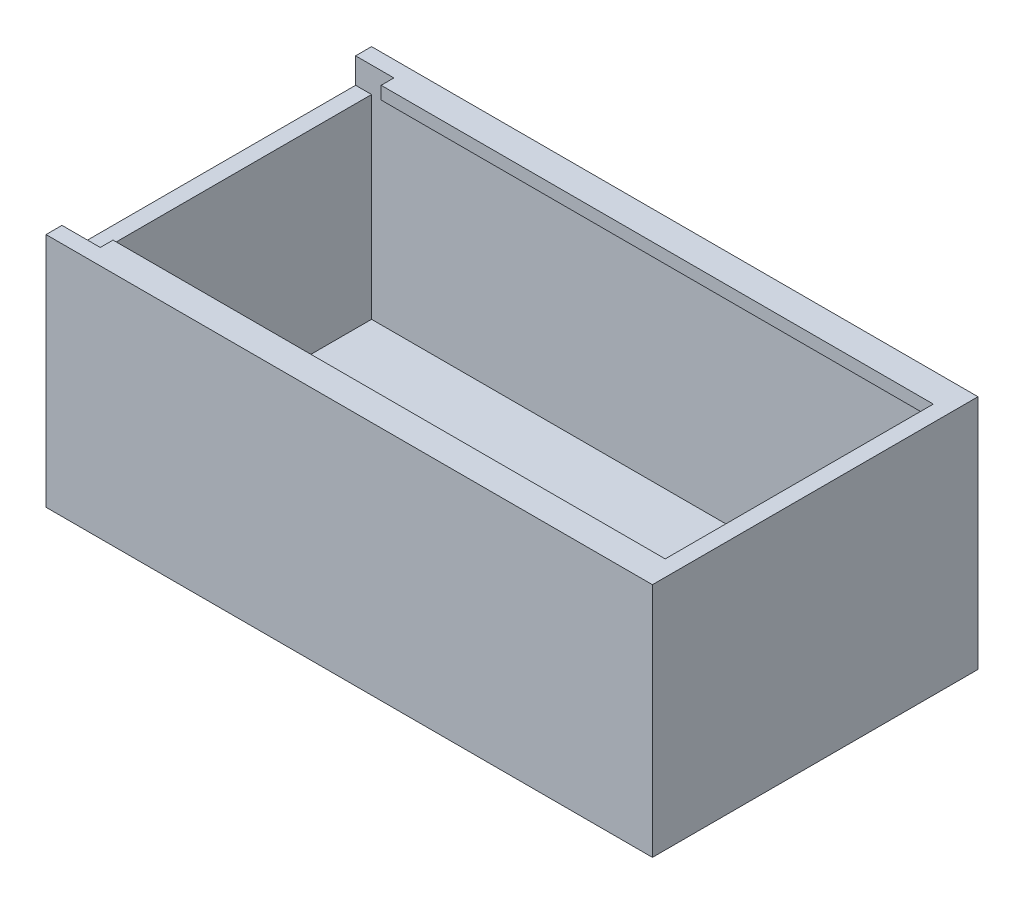
ISO-10303-21;
HEADER;
FILE_DESCRIPTION(('STEP AP214'),'2;1');
FILE_NAME('part.step','',(''),(''),'','','');
FILE_SCHEMA(('AUTOMOTIVE_DESIGN { 1 0 10303 214 1 1 1 1 }'));
ENDSEC;
DATA;
#1=APPLICATION_CONTEXT('core data for automotive mechanical design processes');
#2=APPLICATION_PROTOCOL_DEFINITION('international standard','automotive_design',2000,#1);
#3=PRODUCT_CONTEXT('',#1,'mechanical');
#4=PRODUCT('Part','Part','',(#3));
#5=PRODUCT_RELATED_PRODUCT_CATEGORY('part','',(#4));
#6=PRODUCT_DEFINITION_FORMATION('','',#4);
#7=PRODUCT_DEFINITION_CONTEXT('part definition',#1,'design');
#8=PRODUCT_DEFINITION('design','',#6,#7);
#9=PRODUCT_DEFINITION_SHAPE('','',#8);
#10=(LENGTH_UNIT() NAMED_UNIT(*) SI_UNIT(.MILLI.,.METRE.));
#11=(NAMED_UNIT(*) PLANE_ANGLE_UNIT() SI_UNIT($,.RADIAN.));
#12=(NAMED_UNIT(*) SI_UNIT($,.STERADIAN.) SOLID_ANGLE_UNIT());
#13=UNCERTAINTY_MEASURE_WITH_UNIT(LENGTH_MEASURE(1.E-05),#10,'distance_accuracy_value','');
#14=(GEOMETRIC_REPRESENTATION_CONTEXT(3) GLOBAL_UNCERTAINTY_ASSIGNED_CONTEXT((#13)) GLOBAL_UNIT_ASSIGNED_CONTEXT((#10,
#11,#12)) REPRESENTATION_CONTEXT('',''));
#15=CARTESIAN_POINT('',(0.,0.,0.));
#16=DIRECTION('',(0.,0.,1.));
#17=DIRECTION('',(1.,0.,0.));
#18=AXIS2_PLACEMENT_3D('',#15,#16,#17);
#19=CARTESIAN_POINT('',(0.,2.5,51.));
#20=DIRECTION('',(1.,0.,0.));
#21=DIRECTION('',(0.,0.,-1.));
#22=AXIS2_PLACEMENT_3D('',#19,#20,#21);
#23=PLANE('',#22);
#24=DIRECTION('',(0.,0.,1.));
#25=VECTOR('',#24,1.);
#26=CARTESIAN_POINT('',(0.,33.,2.5));
#27=LINE('',#26,#25);
#28=CARTESIAN_POINT('',(0.,33.,2.5));
#29=VERTEX_POINT('',#28);
#30=CARTESIAN_POINT('',(0.,33.,48.5));
#31=VERTEX_POINT('',#30);
#32=EDGE_CURVE('E205',#29,#31,#27,.T.);
#33=ORIENTED_EDGE('',*,*,#32,.F.);
#34=DIRECTION('',(0.,-1.,0.));
#35=VECTOR('',#34,1.);
#36=CARTESIAN_POINT('',(0.,37.,2.5));
#37=LINE('',#36,#35);
#38=CARTESIAN_POINT('',(0.,37.,2.5));
#39=VERTEX_POINT('',#38);
#40=EDGE_CURVE('E194',#39,#29,#37,.T.);
#41=ORIENTED_EDGE('',*,*,#40,.F.);
#42=DIRECTION('',(0.,0.,1.));
#43=VECTOR('',#42,1.);
#44=CARTESIAN_POINT('',(0.,37.,0.));
#45=LINE('',#44,#43);
#46=CARTESIAN_POINT('',(0.,37.,0.));
#47=VERTEX_POINT('',#46);
#48=EDGE_CURVE('E224',#47,#39,#45,.T.);
#49=ORIENTED_EDGE('',*,*,#48,.F.);
#50=DIRECTION('',(0.,-1.,0.));
#51=VECTOR('',#50,1.);
#52=CARTESIAN_POINT('',(0.,2.5,0.));
#53=LINE('',#52,#51);
#54=CARTESIAN_POINT('',(0.,0.,0.));
#55=VERTEX_POINT('',#54);
#56=EDGE_CURVE('E257',#47,#55,#53,.T.);
#57=ORIENTED_EDGE('',*,*,#56,.T.);
#58=DIRECTION('',(0.,0.,1.));
#59=VECTOR('',#58,1.);
#60=CARTESIAN_POINT('',(0.,0.,51.));
#61=LINE('',#60,#59);
#62=CARTESIAN_POINT('',(0.,0.,51.));
#63=VERTEX_POINT('',#62);
#64=EDGE_CURVE('E248',#55,#63,#61,.T.);
#65=ORIENTED_EDGE('',*,*,#64,.T.);
#66=DIRECTION('',(0.,-1.,0.));
#67=VECTOR('',#66,1.);
#68=CARTESIAN_POINT('',(0.,2.5,51.));
#69=LINE('',#68,#67);
#70=CARTESIAN_POINT('',(0.,37.,51.));
#71=VERTEX_POINT('',#70);
#72=EDGE_CURVE('E11',#71,#63,#69,.T.);
#73=ORIENTED_EDGE('',*,*,#72,.F.);
#74=CARTESIAN_POINT('',(0.,37.,48.5));
#75=VERTEX_POINT('',#74);
#76=EDGE_CURVE('E223',#75,#71,#45,.T.);
#77=ORIENTED_EDGE('',*,*,#76,.F.);
#78=DIRECTION('',(0.,1.,0.));
#79=VECTOR('',#78,1.);
#80=CARTESIAN_POINT('',(0.,37.,48.5));
#81=LINE('',#80,#79);
#82=EDGE_CURVE('E202',#31,#75,#81,.T.);
#83=ORIENTED_EDGE('',*,*,#82,.F.);
#84=EDGE_LOOP('',(#33,#41,#49,#57,#65,#73,#77,#83));
#85=FACE_BOUND('',#84,.T.);
#86=ADVANCED_FACE('F33',(#85),#23,.F.);
#87=CARTESIAN_POINT('',(95.,2.5,51.));
#88=DIRECTION('',(0.,0.,-1.));
#89=DIRECTION('',(-1.,0.,0.));
#90=AXIS2_PLACEMENT_3D('',#87,#88,#89);
#91=PLANE('',#90);
#92=DIRECTION('',(1.,0.,0.));
#93=VECTOR('',#92,1.);
#94=CARTESIAN_POINT('',(95.,0.,51.));
#95=LINE('',#94,#93);
#96=CARTESIAN_POINT('',(95.,0.,51.));
#97=VERTEX_POINT('',#96);
#98=EDGE_CURVE('E251',#63,#97,#95,.T.);
#99=ORIENTED_EDGE('',*,*,#98,.T.);
#100=DIRECTION('',(0.,-1.,0.));
#101=VECTOR('',#100,1.);
#102=CARTESIAN_POINT('',(95.,2.5,51.));
#103=LINE('',#102,#101);
#104=CARTESIAN_POINT('',(95.,37.,51.));
#105=VERTEX_POINT('',#104);
#106=EDGE_CURVE('E40',#105,#97,#103,.T.);
#107=ORIENTED_EDGE('',*,*,#106,.F.);
#108=DIRECTION('',(1.,0.,0.));
#109=VECTOR('',#108,1.);
#110=CARTESIAN_POINT('',(0.,37.,51.));
#111=LINE('',#110,#109);
#112=EDGE_CURVE('E227',#71,#105,#111,.T.);
#113=ORIENTED_EDGE('',*,*,#112,.F.);
#114=ORIENTED_EDGE('',*,*,#72,.T.);
#115=EDGE_LOOP('',(#99,#107,#113,#114));
#116=FACE_BOUND('',#115,.T.);
#117=ADVANCED_FACE('F283',(#116),#91,.F.);
#118=CARTESIAN_POINT('',(95.,2.5,0.));
#119=DIRECTION('',(-1.,0.,0.));
#120=DIRECTION('',(0.,0.,1.));
#121=AXIS2_PLACEMENT_3D('',#118,#119,#120);
#122=PLANE('',#121);
#123=DIRECTION('',(0.,0.,-1.));
#124=VECTOR('',#123,1.);
#125=CARTESIAN_POINT('',(95.,0.,0.));
#126=LINE('',#125,#124);
#127=CARTESIAN_POINT('',(95.,0.,0.));
#128=VERTEX_POINT('',#127);
#129=EDGE_CURVE('E253',#97,#128,#126,.T.);
#130=ORIENTED_EDGE('',*,*,#129,.T.);
#131=DIRECTION('',(0.,-1.,0.));
#132=VECTOR('',#131,1.);
#133=CARTESIAN_POINT('',(95.,2.5,0.));
#134=LINE('',#133,#132);
#135=CARTESIAN_POINT('',(95.,37.,0.));
#136=VERTEX_POINT('',#135);
#137=EDGE_CURVE('E260',#136,#128,#134,.T.);
#138=ORIENTED_EDGE('',*,*,#137,.F.);
#139=DIRECTION('',(0.,0.,-1.));
#140=VECTOR('',#139,1.);
#141=CARTESIAN_POINT('',(95.,37.,0.));
#142=LINE('',#141,#140);
#143=EDGE_CURVE('E230',#105,#136,#142,.T.);
#144=ORIENTED_EDGE('',*,*,#143,.F.);
#145=ORIENTED_EDGE('',*,*,#106,.T.);
#146=EDGE_LOOP('',(#130,#138,#144,#145));
#147=FACE_BOUND('',#146,.T.);
#148=ADVANCED_FACE('F266',(#147),#122,.F.);
#149=CARTESIAN_POINT('',(0.,2.5,0.));
#150=DIRECTION('',(0.,0.,1.));
#151=DIRECTION('',(1.,0.,0.));
#152=AXIS2_PLACEMENT_3D('',#149,#150,#151);
#153=PLANE('',#152);
#154=DIRECTION('',(-1.,0.,0.));
#155=VECTOR('',#154,1.);
#156=CARTESIAN_POINT('',(0.,0.,0.));
#157=LINE('',#156,#155);
#158=EDGE_CURVE('E255',#128,#55,#157,.T.);
#159=ORIENTED_EDGE('',*,*,#158,.T.);
#160=ORIENTED_EDGE('',*,*,#56,.F.);
#161=DIRECTION('',(-1.,0.,0.));
#162=VECTOR('',#161,1.);
#163=CARTESIAN_POINT('',(0.,37.,0.));
#164=LINE('',#163,#162);
#165=EDGE_CURVE('E233',#136,#47,#164,.T.);
#166=ORIENTED_EDGE('',*,*,#165,.F.);
#167=ORIENTED_EDGE('',*,*,#137,.T.);
#168=EDGE_LOOP('',(#159,#160,#166,#167));
#169=FACE_BOUND('',#168,.T.);
#170=ADVANCED_FACE('F274',(#169),#153,.F.);
#171=CARTESIAN_POINT('',(0.,0.,0.));
#172=DIRECTION('',(0.,-1.,0.));
#173=DIRECTION('',(0.,0.,-1.));
#174=AXIS2_PLACEMENT_3D('',#171,#172,#173);
#175=PLANE('',#174);
#176=ORIENTED_EDGE('',*,*,#64,.F.);
#177=ORIENTED_EDGE('',*,*,#158,.F.);
#178=ORIENTED_EDGE('',*,*,#129,.F.);
#179=ORIENTED_EDGE('',*,*,#98,.F.);
#180=EDGE_LOOP('',(#176,#177,#178,#179));
#181=FACE_BOUND('',#180,.T.);
#182=ADVANCED_FACE('F272',(#181),#175,.T.);
#183=CARTESIAN_POINT('',(2.5,37.,2.5));
#184=DIRECTION('',(1.,0.,0.));
#185=DIRECTION('',(0.,0.,-1.));
#186=AXIS2_PLACEMENT_3D('',#183,#184,#185);
#187=PLANE('',#186);
#188=DIRECTION('',(0.,0.,1.));
#189=VECTOR('',#188,1.);
#190=CARTESIAN_POINT('',(2.5,33.,2.5));
#191=LINE('',#190,#189);
#192=CARTESIAN_POINT('',(2.5,33.,2.5));
#193=VERTEX_POINT('',#192);
#194=CARTESIAN_POINT('',(2.5,33.,48.5));
#195=VERTEX_POINT('',#194);
#196=EDGE_CURVE('E198',#193,#195,#191,.T.);
#197=ORIENTED_EDGE('',*,*,#196,.T.);
#198=DIRECTION('',(0.,-1.,0.));
#199=VECTOR('',#198,1.);
#200=CARTESIAN_POINT('',(2.50000000000001,37.,48.5));
#201=LINE('',#200,#199);
#202=CARTESIAN_POINT('',(2.50000000000001,2.5,48.5));
#203=VERTEX_POINT('',#202);
#204=EDGE_CURVE('E221',#195,#203,#201,.T.);
#205=ORIENTED_EDGE('',*,*,#204,.T.);
#206=DIRECTION('',(0.,0.,1.));
#207=VECTOR('',#206,1.);
#208=CARTESIAN_POINT('',(2.5,2.5,0.));
#209=LINE('',#208,#207);
#210=CARTESIAN_POINT('',(2.5,2.5,2.5));
#211=VERTEX_POINT('',#210);
#212=EDGE_CURVE('E245',#211,#203,#209,.T.);
#213=ORIENTED_EDGE('',*,*,#212,.F.);
#214=DIRECTION('',(0.,-1.,0.));
#215=VECTOR('',#214,1.);
#216=CARTESIAN_POINT('',(2.5,37.,2.5));
#217=LINE('',#216,#215);
#218=EDGE_CURVE('E215',#193,#211,#217,.T.);
#219=ORIENTED_EDGE('',*,*,#218,.F.);
#220=EDGE_LOOP('',(#197,#205,#213,#219));
#221=FACE_BOUND('',#220,.T.);
#222=ADVANCED_FACE('F330',(#221),#187,.T.);
#223=CARTESIAN_POINT('',(2.50000000000001,37.,48.5));
#224=DIRECTION('',(0.,0.,-1.));
#225=DIRECTION('',(-1.,0.,0.));
#226=AXIS2_PLACEMENT_3D('',#223,#224,#225);
#227=PLANE('',#226);
#228=DIRECTION('',(-1.,0.,0.));
#229=VECTOR('',#228,1.);
#230=CARTESIAN_POINT('',(92.5,35.,48.5));
#231=LINE('',#230,#229);
#232=CARTESIAN_POINT('',(92.5,35.,48.5));
#233=VERTEX_POINT('',#232);
#234=CARTESIAN_POINT('',(6.,35.,48.5));
#235=VERTEX_POINT('',#234);
#236=EDGE_CURVE('E170',#233,#235,#231,.T.);
#237=ORIENTED_EDGE('',*,*,#236,.F.);
#238=DIRECTION('',(0.,-1.,0.));
#239=VECTOR('',#238,1.);
#240=CARTESIAN_POINT('',(92.5,37.,48.5));
#241=LINE('',#240,#239);
#242=CARTESIAN_POINT('',(92.5,2.5,48.5));
#243=VERTEX_POINT('',#242);
#244=EDGE_CURVE('E219',#233,#243,#241,.T.);
#245=ORIENTED_EDGE('',*,*,#244,.T.);
#246=DIRECTION('',(1.,0.,0.));
#247=VECTOR('',#246,1.);
#248=CARTESIAN_POINT('',(0.,2.5,48.5));
#249=LINE('',#248,#247);
#250=EDGE_CURVE('E242',#203,#243,#249,.T.);
#251=ORIENTED_EDGE('',*,*,#250,.F.);
#252=ORIENTED_EDGE('',*,*,#204,.F.);
#253=DIRECTION('',(-1.,0.,0.));
#254=VECTOR('',#253,1.);
#255=CARTESIAN_POINT('',(2.5,33.,48.5));
#256=LINE('',#255,#254);
#257=EDGE_CURVE('E210',#195,#31,#256,.T.);
#258=ORIENTED_EDGE('',*,*,#257,.T.);
#259=ORIENTED_EDGE('',*,*,#82,.T.);
#260=DIRECTION('',(1.,0.,0.));
#261=VECTOR('',#260,1.);
#262=CARTESIAN_POINT('',(2.50000000000001,37.,48.5));
#263=LINE('',#262,#261);
#264=CARTESIAN_POINT('',(6.,37.,48.5));
#265=VERTEX_POINT('',#264);
#266=EDGE_CURVE('E156',#75,#265,#263,.T.);
#267=ORIENTED_EDGE('',*,*,#266,.T.);
#268=DIRECTION('',(0.,1.,0.));
#269=VECTOR('',#268,1.);
#270=CARTESIAN_POINT('',(6.,37.,48.5));
#271=LINE('',#270,#269);
#272=EDGE_CURVE('E47',#235,#265,#271,.T.);
#273=ORIENTED_EDGE('',*,*,#272,.F.);
#274=EDGE_LOOP('',(#237,#245,#251,#252,#258,#259,#267,#273));
#275=FACE_BOUND('',#274,.T.);
#276=ADVANCED_FACE('F285',(#275),#227,.T.);
#277=CARTESIAN_POINT('',(92.5,37.,2.5));
#278=DIRECTION('',(-1.,0.,0.));
#279=DIRECTION('',(0.,0.,1.));
#280=AXIS2_PLACEMENT_3D('',#277,#278,#279);
#281=PLANE('',#280);
#282=DIRECTION('',(0.,0.,1.));
#283=VECTOR('',#282,1.);
#284=CARTESIAN_POINT('',(92.5,35.,48.5));
#285=LINE('',#284,#283);
#286=CARTESIAN_POINT('',(92.5,35.,46.5));
#287=VERTEX_POINT('',#286);
#288=EDGE_CURVE('E55',#287,#233,#285,.T.);
#289=ORIENTED_EDGE('',*,*,#288,.F.);
#290=DIRECTION('',(0.,-1.,0.));
#291=VECTOR('',#290,1.);
#292=CARTESIAN_POINT('',(92.5,37.,46.5));
#293=LINE('',#292,#291);
#294=CARTESIAN_POINT('',(92.5,37.,46.5));
#295=VERTEX_POINT('',#294);
#296=EDGE_CURVE('E159',#295,#287,#293,.T.);
#297=ORIENTED_EDGE('',*,*,#296,.F.);
#298=DIRECTION('',(0.,0.,-1.));
#299=VECTOR('',#298,1.);
#300=CARTESIAN_POINT('',(92.5,37.,2.5));
#301=LINE('',#300,#299);
#302=CARTESIAN_POINT('',(92.5,37.,4.5));
#303=VERTEX_POINT('',#302);
#304=EDGE_CURVE('E146',#295,#303,#301,.T.);
#305=ORIENTED_EDGE('',*,*,#304,.T.);
#306=DIRECTION('',(0.,1.,0.));
#307=VECTOR('',#306,1.);
#308=CARTESIAN_POINT('',(92.5,37.,4.5));
#309=LINE('',#308,#307);
#310=CARTESIAN_POINT('',(92.5,35.,4.5));
#311=VERTEX_POINT('',#310);
#312=EDGE_CURVE('E178',#311,#303,#309,.T.);
#313=ORIENTED_EDGE('',*,*,#312,.F.);
#314=DIRECTION('',(0.,0.,1.));
#315=VECTOR('',#314,1.);
#316=CARTESIAN_POINT('',(92.5,35.,2.5));
#317=LINE('',#316,#315);
#318=CARTESIAN_POINT('',(92.5,35.,2.5));
#319=VERTEX_POINT('',#318);
#320=EDGE_CURVE('E175',#319,#311,#317,.T.);
#321=ORIENTED_EDGE('',*,*,#320,.F.);
#322=DIRECTION('',(0.,-1.,0.));
#323=VECTOR('',#322,1.);
#324=CARTESIAN_POINT('',(92.5,37.,2.5));
#325=LINE('',#324,#323);
#326=CARTESIAN_POINT('',(92.5,2.5,2.5));
#327=VERTEX_POINT('',#326);
#328=EDGE_CURVE('E217',#319,#327,#325,.T.);
#329=ORIENTED_EDGE('',*,*,#328,.T.);
#330=DIRECTION('',(0.,0.,-1.));
#331=VECTOR('',#330,1.);
#332=CARTESIAN_POINT('',(92.5,2.5,0.));
#333=LINE('',#332,#331);
#334=EDGE_CURVE('E239',#243,#327,#333,.T.);
#335=ORIENTED_EDGE('',*,*,#334,.F.);
#336=ORIENTED_EDGE('',*,*,#244,.F.);
#337=EDGE_LOOP('',(#289,#297,#305,#313,#321,#329,#335,#336));
#338=FACE_BOUND('',#337,.T.);
#339=ADVANCED_FACE('F160',(#338),#281,.T.);
#340=CARTESIAN_POINT('',(2.5,37.,2.5));
#341=DIRECTION('',(0.,0.,1.));
#342=DIRECTION('',(1.,0.,0.));
#343=AXIS2_PLACEMENT_3D('',#340,#341,#342);
#344=PLANE('',#343);
#345=DIRECTION('',(-1.,0.,0.));
#346=VECTOR('',#345,1.);
#347=CARTESIAN_POINT('',(92.5,35.,2.5));
#348=LINE('',#347,#346);
#349=CARTESIAN_POINT('',(6.,35.,2.5));
#350=VERTEX_POINT('',#349);
#351=EDGE_CURVE('E181',#319,#350,#348,.T.);
#352=ORIENTED_EDGE('',*,*,#351,.T.);
#353=DIRECTION('',(0.,-1.,0.));
#354=VECTOR('',#353,1.);
#355=CARTESIAN_POINT('',(6.,37.,2.5));
#356=LINE('',#355,#354);
#357=CARTESIAN_POINT('',(6.,37.,2.5));
#358=VERTEX_POINT('',#357);
#359=EDGE_CURVE('E182',#358,#350,#356,.T.);
#360=ORIENTED_EDGE('',*,*,#359,.F.);
#361=DIRECTION('',(-1.,0.,0.));
#362=VECTOR('',#361,1.);
#363=CARTESIAN_POINT('',(2.5,37.,2.5));
#364=LINE('',#363,#362);
#365=EDGE_CURVE('E155',#358,#39,#364,.T.);
#366=ORIENTED_EDGE('',*,*,#365,.T.);
#367=ORIENTED_EDGE('',*,*,#40,.T.);
#368=DIRECTION('',(-1.,0.,0.));
#369=VECTOR('',#368,1.);
#370=CARTESIAN_POINT('',(2.5,33.,2.5));
#371=LINE('',#370,#369);
#372=EDGE_CURVE('E201',#193,#29,#371,.T.);
#373=ORIENTED_EDGE('',*,*,#372,.F.);
#374=ORIENTED_EDGE('',*,*,#218,.T.);
#375=DIRECTION('',(-1.,0.,0.));
#376=VECTOR('',#375,1.);
#377=CARTESIAN_POINT('',(0.,2.5,2.5));
#378=LINE('',#377,#376);
#379=EDGE_CURVE('E236',#327,#211,#378,.T.);
#380=ORIENTED_EDGE('',*,*,#379,.F.);
#381=ORIENTED_EDGE('',*,*,#328,.F.);
#382=EDGE_LOOP('',(#352,#360,#366,#367,#373,#374,#380,#381));
#383=FACE_BOUND('',#382,.T.);
#384=ADVANCED_FACE('F293',(#383),#344,.T.);
#385=CARTESIAN_POINT('',(0.,37.,0.));
#386=DIRECTION('',(0.,1.,0.));
#387=DIRECTION('',(0.,0.,1.));
#388=AXIS2_PLACEMENT_3D('',#385,#386,#387);
#389=PLANE('',#388);
#390=DIRECTION('',(0.,0.,-1.));
#391=VECTOR('',#390,1.);
#392=CARTESIAN_POINT('',(6.,37.,48.5));
#393=LINE('',#392,#391);
#394=CARTESIAN_POINT('',(6.,37.,46.5));
#395=VERTEX_POINT('',#394);
#396=EDGE_CURVE('E402',#265,#395,#393,.T.);
#397=ORIENTED_EDGE('',*,*,#396,.F.);
#398=ORIENTED_EDGE('',*,*,#266,.F.);
#399=ORIENTED_EDGE('',*,*,#76,.T.);
#400=ORIENTED_EDGE('',*,*,#112,.T.);
#401=ORIENTED_EDGE('',*,*,#143,.T.);
#402=ORIENTED_EDGE('',*,*,#165,.T.);
#403=ORIENTED_EDGE('',*,*,#48,.T.);
#404=ORIENTED_EDGE('',*,*,#365,.F.);
#405=DIRECTION('',(0.,0.,-1.));
#406=VECTOR('',#405,1.);
#407=CARTESIAN_POINT('',(6.,37.,2.5));
#408=LINE('',#407,#406);
#409=CARTESIAN_POINT('',(6.,37.,4.5));
#410=VERTEX_POINT('',#409);
#411=EDGE_CURVE('E179',#410,#358,#408,.T.);
#412=ORIENTED_EDGE('',*,*,#411,.F.);
#413=DIRECTION('',(-1.,0.,0.));
#414=VECTOR('',#413,1.);
#415=CARTESIAN_POINT('',(92.5,37.,4.5));
#416=LINE('',#415,#414);
#417=EDGE_CURVE('E153',#303,#410,#416,.T.);
#418=ORIENTED_EDGE('',*,*,#417,.F.);
#419=ORIENTED_EDGE('',*,*,#304,.F.);
#420=DIRECTION('',(-1.,0.,0.));
#421=VECTOR('',#420,1.);
#422=CARTESIAN_POINT('',(92.5,37.,46.5));
#423=LINE('',#422,#421);
#424=EDGE_CURVE('E150',#295,#395,#423,.T.);
#425=ORIENTED_EDGE('',*,*,#424,.T.);
#426=EDGE_LOOP('',(#397,#398,#399,#400,#401,#402,#403,#404,#412,#418,#419,#425));
#427=FACE_BOUND('',#426,.T.);
#428=ADVANCED_FACE('F148',(#427),#389,.T.);
#429=CARTESIAN_POINT('',(0.,2.5,0.));
#430=DIRECTION('',(0.,-1.,0.));
#431=DIRECTION('',(0.,0.,-1.));
#432=AXIS2_PLACEMENT_3D('',#429,#430,#431);
#433=PLANE('',#432);
#434=ORIENTED_EDGE('',*,*,#379,.T.);
#435=ORIENTED_EDGE('',*,*,#212,.T.);
#436=ORIENTED_EDGE('',*,*,#250,.T.);
#437=ORIENTED_EDGE('',*,*,#334,.T.);
#438=EDGE_LOOP('',(#434,#435,#436,#437));
#439=FACE_BOUND('',#438,.T.);
#440=ADVANCED_FACE('F331',(#439),#433,.F.);
#441=CARTESIAN_POINT('',(2.5,33.,2.5));
#442=DIRECTION('',(0.,-1.,0.));
#443=DIRECTION('',(0.,0.,-1.));
#444=AXIS2_PLACEMENT_3D('',#441,#442,#443);
#445=PLANE('',#444);
#446=ORIENTED_EDGE('',*,*,#32,.T.);
#447=ORIENTED_EDGE('',*,*,#257,.F.);
#448=ORIENTED_EDGE('',*,*,#196,.F.);
#449=ORIENTED_EDGE('',*,*,#372,.T.);
#450=EDGE_LOOP('',(#446,#447,#448,#449));
#451=FACE_BOUND('',#450,.T.);
#452=ADVANCED_FACE('F290',(#451),#445,.F.);
#453=CARTESIAN_POINT('',(92.5,37.,4.5));
#454=DIRECTION('',(0.,0.,1.));
#455=DIRECTION('',(1.,0.,0.));
#456=AXIS2_PLACEMENT_3D('',#453,#454,#455);
#457=PLANE('',#456);
#458=DIRECTION('',(0.,1.,0.));
#459=VECTOR('',#458,1.);
#460=CARTESIAN_POINT('',(6.,37.,4.5));
#461=LINE('',#460,#459);
#462=CARTESIAN_POINT('',(6.,35.,4.5));
#463=VERTEX_POINT('',#462);
#464=EDGE_CURVE('E188',#463,#410,#461,.T.);
#465=ORIENTED_EDGE('',*,*,#464,.F.);
#466=DIRECTION('',(-1.,0.,0.));
#467=VECTOR('',#466,1.);
#468=CARTESIAN_POINT('',(92.5,35.,4.5));
#469=LINE('',#468,#467);
#470=EDGE_CURVE('E195',#311,#463,#469,.T.);
#471=ORIENTED_EDGE('',*,*,#470,.F.);
#472=ORIENTED_EDGE('',*,*,#312,.T.);
#473=ORIENTED_EDGE('',*,*,#417,.T.);
#474=EDGE_LOOP('',(#465,#471,#472,#473));
#475=FACE_BOUND('',#474,.T.);
#476=ADVANCED_FACE('F302',(#475),#457,.T.);
#477=CARTESIAN_POINT('',(92.5,35.,2.5));
#478=DIRECTION('',(0.,-1.,0.));
#479=DIRECTION('',(0.,0.,-1.));
#480=AXIS2_PLACEMENT_3D('',#477,#478,#479);
#481=PLANE('',#480);
#482=DIRECTION('',(0.,0.,1.));
#483=VECTOR('',#482,1.);
#484=CARTESIAN_POINT('',(6.,35.,2.5));
#485=LINE('',#484,#483);
#486=EDGE_CURVE('E185',#350,#463,#485,.T.);
#487=ORIENTED_EDGE('',*,*,#486,.F.);
#488=ORIENTED_EDGE('',*,*,#351,.F.);
#489=ORIENTED_EDGE('',*,*,#320,.T.);
#490=ORIENTED_EDGE('',*,*,#470,.T.);
#491=EDGE_LOOP('',(#487,#488,#489,#490));
#492=FACE_BOUND('',#491,.T.);
#493=ADVANCED_FACE('F306',(#492),#481,.T.);
#494=CARTESIAN_POINT('',(6.,0.,0.));
#495=DIRECTION('',(-1.,0.,0.));
#496=DIRECTION('',(0.,0.,1.));
#497=AXIS2_PLACEMENT_3D('',#494,#495,#496);
#498=PLANE('',#497);
#499=ORIENTED_EDGE('',*,*,#359,.T.);
#500=ORIENTED_EDGE('',*,*,#486,.T.);
#501=ORIENTED_EDGE('',*,*,#464,.T.);
#502=ORIENTED_EDGE('',*,*,#411,.T.);
#503=EDGE_LOOP('',(#499,#500,#501,#502));
#504=FACE_BOUND('',#503,.T.);
#505=ADVANCED_FACE('F298',(#504),#498,.T.);
#506=CARTESIAN_POINT('',(92.5,35.,48.5));
#507=DIRECTION('',(0.,-1.,0.));
#508=DIRECTION('',(0.,0.,-1.));
#509=AXIS2_PLACEMENT_3D('',#506,#507,#508);
#510=PLANE('',#509);
#511=DIRECTION('',(0.,0.,1.));
#512=VECTOR('',#511,1.);
#513=CARTESIAN_POINT('',(6.,35.,48.5));
#514=LINE('',#513,#512);
#515=CARTESIAN_POINT('',(6.,35.,46.5));
#516=VERTEX_POINT('',#515);
#517=EDGE_CURVE('E162',#516,#235,#514,.T.);
#518=ORIENTED_EDGE('',*,*,#517,.F.);
#519=DIRECTION('',(-1.,0.,0.));
#520=VECTOR('',#519,1.);
#521=CARTESIAN_POINT('',(92.5,35.,46.5));
#522=LINE('',#521,#520);
#523=EDGE_CURVE('E168',#287,#516,#522,.T.);
#524=ORIENTED_EDGE('',*,*,#523,.F.);
#525=ORIENTED_EDGE('',*,*,#288,.T.);
#526=ORIENTED_EDGE('',*,*,#236,.T.);
#527=EDGE_LOOP('',(#518,#524,#525,#526));
#528=FACE_BOUND('',#527,.T.);
#529=ADVANCED_FACE('F313',(#528),#510,.T.);
#530=CARTESIAN_POINT('',(92.5,37.,46.5));
#531=DIRECTION('',(0.,0.,-1.));
#532=DIRECTION('',(-1.,0.,0.));
#533=AXIS2_PLACEMENT_3D('',#530,#531,#532);
#534=PLANE('',#533);
#535=DIRECTION('',(0.,-1.,0.));
#536=VECTOR('',#535,1.);
#537=CARTESIAN_POINT('',(6.,37.,46.5));
#538=LINE('',#537,#536);
#539=EDGE_CURVE('E166',#395,#516,#538,.T.);
#540=ORIENTED_EDGE('',*,*,#539,.F.);
#541=ORIENTED_EDGE('',*,*,#424,.F.);
#542=ORIENTED_EDGE('',*,*,#296,.T.);
#543=ORIENTED_EDGE('',*,*,#523,.T.);
#544=EDGE_LOOP('',(#540,#541,#542,#543));
#545=FACE_BOUND('',#544,.T.);
#546=ADVANCED_FACE('F164',(#545),#534,.T.);
#547=CARTESIAN_POINT('',(6.,0.,0.));
#548=DIRECTION('',(1.,0.,0.));
#549=DIRECTION('',(0.,0.,-1.));
#550=AXIS2_PLACEMENT_3D('',#547,#548,#549);
#551=PLANE('',#550);
#552=ORIENTED_EDGE('',*,*,#272,.T.);
#553=ORIENTED_EDGE('',*,*,#396,.T.);
#554=ORIENTED_EDGE('',*,*,#539,.T.);
#555=ORIENTED_EDGE('',*,*,#517,.T.);
#556=EDGE_LOOP('',(#552,#553,#554,#555));
#557=FACE_BOUND('',#556,.T.);
#558=ADVANCED_FACE('F388',(#557),#551,.F.);
#559=CLOSED_SHELL('',(#86,#117,#148,#170,#182,#222,#276,#339,#384,#428,#440,#452,#476,#493,#505,
#529,#546,#558));
#560=MANIFOLD_SOLID_BREP('B2',#559);
#561=ADVANCED_BREP_SHAPE_REPRESENTATION('',(#18,#560),#14);
#562=SHAPE_DEFINITION_REPRESENTATION(#9,#561);
ENDSEC;
END-ISO-10303-21;
